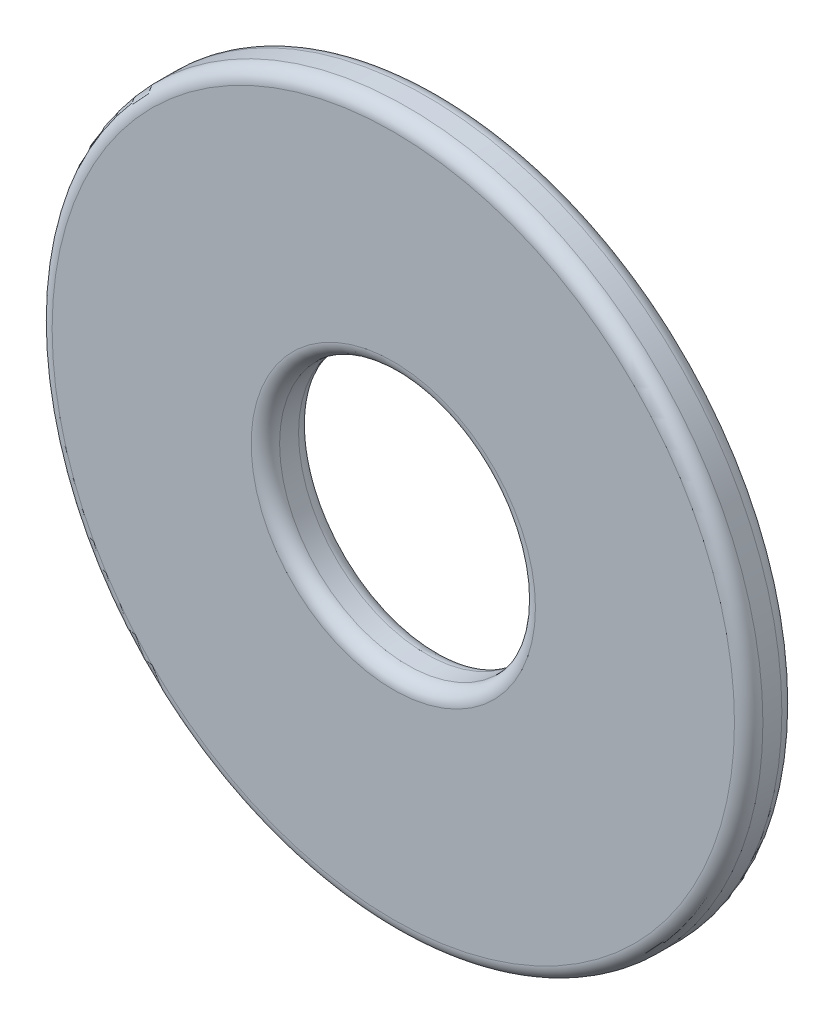
ISO-10303-21;
HEADER;
FILE_DESCRIPTION(('STEP AP214'),'2;1');
FILE_NAME('part.step','',(''),(''),'','','');
FILE_SCHEMA(('AUTOMOTIVE_DESIGN { 1 0 10303 214 1 1 1 1 }'));
ENDSEC;
DATA;
#1=APPLICATION_CONTEXT('core data for automotive mechanical design processes');
#2=APPLICATION_PROTOCOL_DEFINITION('international standard','automotive_design',2000,#1);
#3=PRODUCT_CONTEXT('',#1,'mechanical');
#4=PRODUCT('Part','Part','',(#3));
#5=PRODUCT_RELATED_PRODUCT_CATEGORY('part','',(#4));
#6=PRODUCT_DEFINITION_FORMATION('','',#4);
#7=PRODUCT_DEFINITION_CONTEXT('part definition',#1,'design');
#8=PRODUCT_DEFINITION('design','',#6,#7);
#9=PRODUCT_DEFINITION_SHAPE('','',#8);
#10=(LENGTH_UNIT() NAMED_UNIT(*) SI_UNIT(.MILLI.,.METRE.));
#11=(NAMED_UNIT(*) PLANE_ANGLE_UNIT() SI_UNIT($,.RADIAN.));
#12=(NAMED_UNIT(*) SI_UNIT($,.STERADIAN.) SOLID_ANGLE_UNIT());
#13=UNCERTAINTY_MEASURE_WITH_UNIT(LENGTH_MEASURE(1.E-05),#10,'distance_accuracy_value','');
#14=(GEOMETRIC_REPRESENTATION_CONTEXT(3) GLOBAL_UNCERTAINTY_ASSIGNED_CONTEXT((#13)) GLOBAL_UNIT_ASSIGNED_CONTEXT((#10,
#11,#12)) REPRESENTATION_CONTEXT('',''));
#15=CARTESIAN_POINT('',(0.,0.,0.));
#16=DIRECTION('',(0.,0.,1.));
#17=DIRECTION('',(1.,0.,0.));
#18=AXIS2_PLACEMENT_3D('',#15,#16,#17);
#19=CARTESIAN_POINT('',(0.,0.,1.));
#20=DIRECTION('',(0.,0.,1.));
#21=DIRECTION('',(1.,0.,0.));
#22=AXIS2_PLACEMENT_3D('',#19,#20,#21);
#23=PLANE('',#22);
#24=CARTESIAN_POINT('',(0.,0.,1.));
#25=DIRECTION('',(0.,0.,1.));
#26=DIRECTION('',(1.,0.,0.));
#27=AXIS2_PLACEMENT_3D('',#24,#25,#26);
#28=CIRCLE('',#27,3.);
#29=CARTESIAN_POINT('',(3.,0.,1.));
#30=VERTEX_POINT('',#29);
#31=EDGE_CURVE('E10',#30,#30,#28,.F.);
#32=ORIENTED_EDGE('',*,*,#31,.T.);
#33=EDGE_LOOP('',(#32));
#34=FACE_BOUND('',#33,.T.);
#35=CARTESIAN_POINT('',(0.,0.,1.));
#36=DIRECTION('',(0.,0.,1.));
#37=DIRECTION('',(1.,0.,0.));
#38=AXIS2_PLACEMENT_3D('',#35,#36,#37);
#39=CIRCLE('',#38,7.2);
#40=CARTESIAN_POINT('',(7.2,0.,1.));
#41=VERTEX_POINT('',#40);
#42=EDGE_CURVE('E48',#41,#41,#39,.T.);
#43=ORIENTED_EDGE('',*,*,#42,.T.);
#44=EDGE_LOOP('',(#43));
#45=FACE_BOUND('',#44,.T.);
#46=ADVANCED_FACE('F41',(#34,#45),#23,.T.);
#47=CARTESIAN_POINT('',(0.,0.,0.));
#48=DIRECTION('',(0.,0.,1.));
#49=DIRECTION('',(1.,0.,0.));
#50=AXIS2_PLACEMENT_3D('',#47,#48,#49);
#51=PLANE('',#50);
#52=CARTESIAN_POINT('',(0.,0.,0.));
#53=DIRECTION('',(0.,0.,1.));
#54=DIRECTION('',(1.,0.,0.));
#55=AXIS2_PLACEMENT_3D('',#52,#53,#54);
#56=CIRCLE('',#55,3.);
#57=CARTESIAN_POINT('',(3.,0.,0.));
#58=VERTEX_POINT('',#57);
#59=EDGE_CURVE('E67',#58,#58,#56,.T.);
#60=ORIENTED_EDGE('',*,*,#59,.T.);
#61=EDGE_LOOP('',(#60));
#62=FACE_BOUND('',#61,.T.);
#63=CARTESIAN_POINT('',(0.,0.,0.));
#64=DIRECTION('',(0.,0.,1.));
#65=DIRECTION('',(1.,0.,0.));
#66=AXIS2_PLACEMENT_3D('',#63,#64,#65);
#67=CIRCLE('',#66,7.2);
#68=CARTESIAN_POINT('',(7.2,0.,0.));
#69=VERTEX_POINT('',#68);
#70=EDGE_CURVE('E70',#69,#69,#67,.F.);
#71=ORIENTED_EDGE('',*,*,#70,.T.);
#72=EDGE_LOOP('',(#71));
#73=FACE_BOUND('',#72,.T.);
#74=ADVANCED_FACE('F74',(#62,#73),#51,.F.);
#75=CARTESIAN_POINT('',(0.,0.,1.));
#76=DIRECTION('',(0.,0.,-1.));
#77=DIRECTION('',(-1.,0.,0.));
#78=AXIS2_PLACEMENT_3D('',#75,#76,#77);
#79=CYLINDRICAL_SURFACE('',#78,7.5);
#80=CARTESIAN_POINT('',(0.,0.,0.3));
#81=DIRECTION('',(0.,0.,1.));
#82=DIRECTION('',(1.,0.,0.));
#83=AXIS2_PLACEMENT_3D('',#80,#81,#82);
#84=CIRCLE('',#83,7.5);
#85=CARTESIAN_POINT('',(7.5,0.,0.3));
#86=VERTEX_POINT('',#85);
#87=EDGE_CURVE('E52',#86,#86,#84,.T.);
#88=ORIENTED_EDGE('',*,*,#87,.T.);
#89=EDGE_LOOP('',(#88));
#90=FACE_BOUND('',#89,.T.);
#91=CARTESIAN_POINT('',(0.,0.,0.7));
#92=DIRECTION('',(0.,0.,1.));
#93=DIRECTION('',(1.,0.,0.));
#94=AXIS2_PLACEMENT_3D('',#91,#92,#93);
#95=CIRCLE('',#94,7.5);
#96=CARTESIAN_POINT('',(7.5,0.,0.7));
#97=VERTEX_POINT('',#96);
#98=EDGE_CURVE('E56',#97,#97,#95,.F.);
#99=ORIENTED_EDGE('',*,*,#98,.T.);
#100=EDGE_LOOP('',(#99));
#101=FACE_BOUND('',#100,.T.);
#102=ADVANCED_FACE('F84',(#90,#101),#79,.T.);
#103=CARTESIAN_POINT('',(0.,0.,1.));
#104=DIRECTION('',(0.,0.,-1.));
#105=DIRECTION('',(-1.,0.,0.));
#106=AXIS2_PLACEMENT_3D('',#103,#104,#105);
#107=CYLINDRICAL_SURFACE('',#106,2.7);
#108=CARTESIAN_POINT('',(0.,0.,0.3));
#109=DIRECTION('',(0.,0.,1.));
#110=DIRECTION('',(1.,0.,0.));
#111=AXIS2_PLACEMENT_3D('',#108,#109,#110);
#112=CIRCLE('',#111,2.7);
#113=CARTESIAN_POINT('',(2.7,0.,0.3));
#114=VERTEX_POINT('',#113);
#115=EDGE_CURVE('E61',#114,#114,#112,.F.);
#116=ORIENTED_EDGE('',*,*,#115,.T.);
#117=EDGE_LOOP('',(#116));
#118=FACE_BOUND('',#117,.T.);
#119=CARTESIAN_POINT('',(0.,0.,0.7));
#120=DIRECTION('',(0.,0.,1.));
#121=DIRECTION('',(1.,0.,0.));
#122=AXIS2_PLACEMENT_3D('',#119,#120,#121);
#123=CIRCLE('',#122,2.7);
#124=CARTESIAN_POINT('',(2.7,0.,0.7));
#125=VERTEX_POINT('',#124);
#126=EDGE_CURVE('E64',#125,#125,#123,.T.);
#127=ORIENTED_EDGE('',*,*,#126,.T.);
#128=EDGE_LOOP('',(#127));
#129=FACE_BOUND('',#128,.T.);
#130=ADVANCED_FACE('F87',(#118,#129),#107,.F.);
#131=CARTESIAN_POINT('',(0.,0.,0.3));
#132=DIRECTION('',(0.,0.,1.));
#133=DIRECTION('',(1.,0.,0.));
#134=AXIS2_PLACEMENT_3D('',#131,#132,#133);
#135=TOROIDAL_SURFACE('',#134,3.,0.3);
#136=ORIENTED_EDGE('',*,*,#115,.F.);
#137=EDGE_LOOP('',(#136));
#138=FACE_BOUND('',#137,.T.);
#139=ORIENTED_EDGE('',*,*,#59,.F.);
#140=EDGE_LOOP('',(#139));
#141=FACE_BOUND('',#140,.T.);
#142=ADVANCED_FACE('F80',(#138,#141),#135,.T.);
#143=CARTESIAN_POINT('',(0.,0.,0.3));
#144=DIRECTION('',(0.,0.,1.));
#145=DIRECTION('',(1.,0.,0.));
#146=AXIS2_PLACEMENT_3D('',#143,#144,#145);
#147=TOROIDAL_SURFACE('',#146,7.2,0.3);
#148=ORIENTED_EDGE('',*,*,#70,.F.);
#149=EDGE_LOOP('',(#148));
#150=FACE_BOUND('',#149,.T.);
#151=ORIENTED_EDGE('',*,*,#87,.F.);
#152=EDGE_LOOP('',(#151));
#153=FACE_BOUND('',#152,.T.);
#154=ADVANCED_FACE('F76',(#150,#153),#147,.T.);
#155=CARTESIAN_POINT('',(0.,0.,0.7));
#156=DIRECTION('',(0.,0.,1.));
#157=DIRECTION('',(1.,0.,0.));
#158=AXIS2_PLACEMENT_3D('',#155,#156,#157);
#159=TOROIDAL_SURFACE('',#158,3.,0.3);
#160=ORIENTED_EDGE('',*,*,#31,.F.);
#161=EDGE_LOOP('',(#160));
#162=FACE_BOUND('',#161,.T.);
#163=ORIENTED_EDGE('',*,*,#126,.F.);
#164=EDGE_LOOP('',(#163));
#165=FACE_BOUND('',#164,.T.);
#166=ADVANCED_FACE('F79',(#162,#165),#159,.T.);
#167=CARTESIAN_POINT('',(0.,0.,0.7));
#168=DIRECTION('',(0.,0.,1.));
#169=DIRECTION('',(1.,0.,0.));
#170=AXIS2_PLACEMENT_3D('',#167,#168,#169);
#171=TOROIDAL_SURFACE('',#170,7.2,0.3);
#172=ORIENTED_EDGE('',*,*,#98,.F.);
#173=EDGE_LOOP('',(#172));
#174=FACE_BOUND('',#173,.T.);
#175=ORIENTED_EDGE('',*,*,#42,.F.);
#176=EDGE_LOOP('',(#175));
#177=FACE_BOUND('',#176,.T.);
#178=ADVANCED_FACE('F43',(#174,#177),#171,.T.);
#179=CLOSED_SHELL('',(#46,#74,#102,#130,#142,#154,#166,#178));
#180=MANIFOLD_SOLID_BREP('B2',#179);
#181=ADVANCED_BREP_SHAPE_REPRESENTATION('',(#18,#180),#14);
#182=SHAPE_DEFINITION_REPRESENTATION(#9,#181);
ENDSEC;
END-ISO-10303-21;
